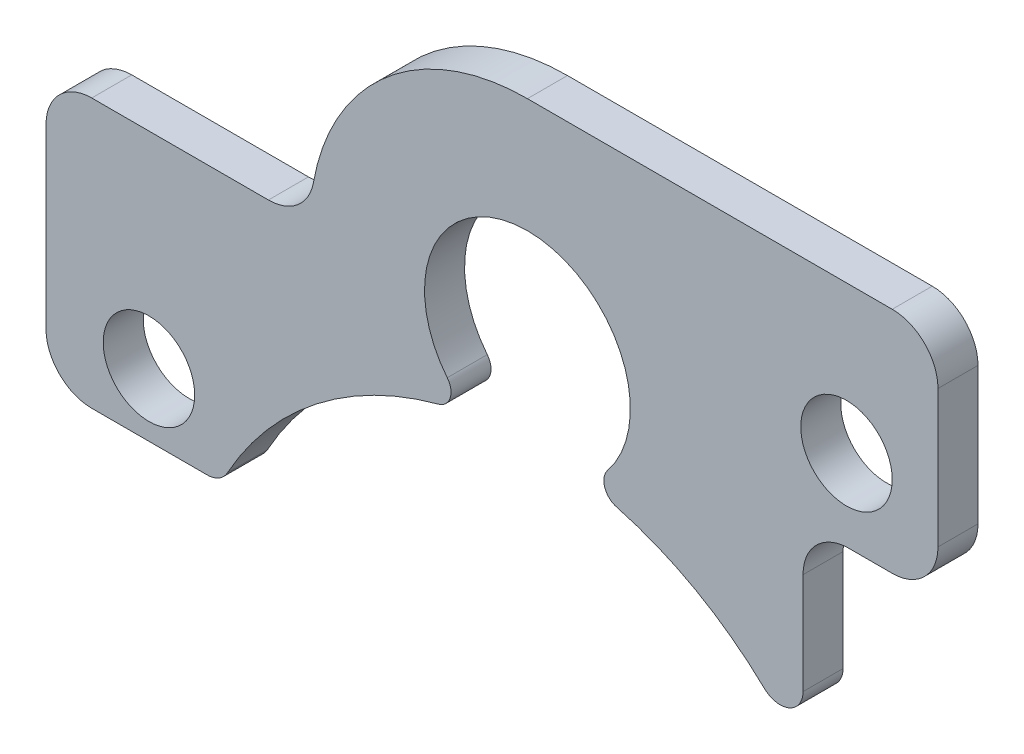
ISO-10303-21;
HEADER;
FILE_DESCRIPTION(('STEP AP214'),'2;1');
FILE_NAME('part.step','',(''),(''),'','','');
FILE_SCHEMA(('AUTOMOTIVE_DESIGN { 1 0 10303 214 1 1 1 1 }'));
ENDSEC;
DATA;
#1=APPLICATION_CONTEXT('core data for automotive mechanical design processes');
#2=APPLICATION_PROTOCOL_DEFINITION('international standard','automotive_design',2000,#1);
#3=PRODUCT_CONTEXT('',#1,'mechanical');
#4=PRODUCT('Part','Part','',(#3));
#5=PRODUCT_RELATED_PRODUCT_CATEGORY('part','',(#4));
#6=PRODUCT_DEFINITION_FORMATION('','',#4);
#7=PRODUCT_DEFINITION_CONTEXT('part definition',#1,'design');
#8=PRODUCT_DEFINITION('design','',#6,#7);
#9=PRODUCT_DEFINITION_SHAPE('','',#8);
#10=(LENGTH_UNIT() NAMED_UNIT(*) SI_UNIT(.MILLI.,.METRE.));
#11=(NAMED_UNIT(*) PLANE_ANGLE_UNIT() SI_UNIT($,.RADIAN.));
#12=(NAMED_UNIT(*) SI_UNIT($,.STERADIAN.) SOLID_ANGLE_UNIT());
#13=UNCERTAINTY_MEASURE_WITH_UNIT(LENGTH_MEASURE(1.E-05),#10,'distance_accuracy_value','');
#14=(GEOMETRIC_REPRESENTATION_CONTEXT(3) GLOBAL_UNCERTAINTY_ASSIGNED_CONTEXT((#13)) GLOBAL_UNIT_ASSIGNED_CONTEXT((#10,
#11,#12)) REPRESENTATION_CONTEXT('',''));
#15=CARTESIAN_POINT('',(0.,0.,0.));
#16=DIRECTION('',(0.,0.,1.));
#17=DIRECTION('',(1.,0.,0.));
#18=AXIS2_PLACEMENT_3D('',#15,#16,#17);
#19=CARTESIAN_POINT('',(0.,0.,1.75));
#20=DIRECTION('',(0.,0.,1.));
#21=DIRECTION('',(1.,0.,0.));
#22=AXIS2_PLACEMENT_3D('',#19,#20,#21);
#23=PLANE('',#22);
#24=CARTESIAN_POINT('',(-16.55,-9.,1.75));
#25=DIRECTION('',(0.,0.,1.));
#26=DIRECTION('',(1.,0.,0.));
#27=AXIS2_PLACEMENT_3D('',#24,#25,#26);
#28=CIRCLE('',#27,2.);
#29=CARTESIAN_POINT('',(-14.55,-9.,1.75));
#30=VERTEX_POINT('',#29);
#31=EDGE_CURVE('E211',#30,#30,#28,.T.);
#32=ORIENTED_EDGE('',*,*,#31,.F.);
#33=EDGE_LOOP('',(#32));
#34=FACE_BOUND('',#33,.T.);
#35=CARTESIAN_POINT('',(0.,0.,1.75));
#36=DIRECTION('',(0.,0.,1.));
#37=DIRECTION('',(1.,0.,0.));
#38=AXIS2_PLACEMENT_3D('',#35,#36,#37);
#39=CIRCLE('',#38,9.5);
#40=CARTESIAN_POINT('',(0.,9.5,1.75));
#41=VERTEX_POINT('',#40);
#42=CARTESIAN_POINT('',(-9.35522962631375,1.65217391304348,1.75));
#43=VERTEX_POINT('',#42);
#44=EDGE_CURVE('E250',#41,#43,#39,.T.);
#45=ORIENTED_EDGE('',*,*,#44,.T.);
#46=CARTESIAN_POINT('',(-11.3247516529061,2.,1.75));
#47=DIRECTION('',(0.,0.,-1.));
#48=DIRECTION('',(1.,0.,0.));
#49=AXIS2_PLACEMENT_3D('',#46,#47,#48);
#50=CIRCLE('',#49,2.);
#51=CARTESIAN_POINT('',(-11.3247516529061,0.,1.75));
#52=VERTEX_POINT('',#51);
#53=EDGE_CURVE('E131',#43,#52,#50,.T.);
#54=ORIENTED_EDGE('',*,*,#53,.T.);
#55=DIRECTION('',(-1.,0.,0.));
#56=VECTOR('',#55,1.);
#57=CARTESIAN_POINT('',(-11.3247516529061,0.,1.75));
#58=LINE('',#57,#56);
#59=CARTESIAN_POINT('',(-19.05,0.,1.75));
#60=VERTEX_POINT('',#59);
#61=EDGE_CURVE('E304',#52,#60,#58,.T.);
#62=ORIENTED_EDGE('',*,*,#61,.T.);
#63=CARTESIAN_POINT('',(-19.05,-2.,1.75));
#64=DIRECTION('',(0.,0.,1.));
#65=DIRECTION('',(1.,0.,0.));
#66=AXIS2_PLACEMENT_3D('',#63,#64,#65);
#67=CIRCLE('',#66,2.);
#68=CARTESIAN_POINT('',(-21.05,-2.,1.75));
#69=VERTEX_POINT('',#68);
#70=EDGE_CURVE('E323',#60,#69,#67,.T.);
#71=ORIENTED_EDGE('',*,*,#70,.T.);
#72=DIRECTION('',(0.,-1.,0.));
#73=VECTOR('',#72,1.);
#74=CARTESIAN_POINT('',(-21.05,-2.,1.75));
#75=LINE('',#74,#73);
#76=CARTESIAN_POINT('',(-21.05,-9.75,1.75));
#77=VERTEX_POINT('',#76);
#78=EDGE_CURVE('E320',#69,#77,#75,.T.);
#79=ORIENTED_EDGE('',*,*,#78,.T.);
#80=CARTESIAN_POINT('',(-19.05,-9.75,1.75));
#81=DIRECTION('',(0.,0.,1.));
#82=DIRECTION('',(1.,0.,0.));
#83=AXIS2_PLACEMENT_3D('',#80,#81,#82);
#84=CIRCLE('',#83,2.);
#85=CARTESIAN_POINT('',(-19.05,-11.75,1.75));
#86=VERTEX_POINT('',#85);
#87=EDGE_CURVE('E322',#77,#86,#84,.T.);
#88=ORIENTED_EDGE('',*,*,#87,.T.);
#89=DIRECTION('',(1.,0.,0.));
#90=VECTOR('',#89,1.);
#91=CARTESIAN_POINT('',(-19.05,-11.75,1.75));
#92=LINE('',#91,#90);
#93=CARTESIAN_POINT('',(-13.9977676791694,-11.75,1.75));
#94=VERTEX_POINT('',#93);
#95=EDGE_CURVE('E325',#86,#94,#92,.T.);
#96=ORIENTED_EDGE('',*,*,#95,.T.);
#97=CARTESIAN_POINT('',(-13.9977676791694,-10.75,1.75));
#98=DIRECTION('',(0.,0.,1.));
#99=DIRECTION('',(1.,0.,0.));
#100=AXIS2_PLACEMENT_3D('',#97,#98,#99);
#101=CIRCLE('',#100,0.999999999999996);
#102=CARTESIAN_POINT('',(-13.1229071992214,-11.234375,1.75));
#103=VERTEX_POINT('',#102);
#104=EDGE_CURVE('E331',#94,#103,#101,.T.);
#105=ORIENTED_EDGE('',*,*,#104,.T.);
#106=CARTESIAN_POINT('',(0.,-18.5000000000001,1.75));
#107=DIRECTION('',(0.,0.,-1.));
#108=DIRECTION('',(1.,0.,0.));
#109=AXIS2_PLACEMENT_3D('',#106,#107,#108);
#110=CIRCLE('',#109,15.);
#111=CARTESIAN_POINT('',(-3.89602308437418,-4.01480051480054,1.75));
#112=VERTEX_POINT('',#111);
#113=EDGE_CURVE('E333',#103,#112,#110,.T.);
#114=ORIENTED_EDGE('',*,*,#113,.T.);
#115=CARTESIAN_POINT('',(-4.0908242385929,-3.29054054054054,1.75));
#116=DIRECTION('',(0.,0.,1.));
#117=DIRECTION('',(1.,0.,0.));
#118=AXIS2_PLACEMENT_3D('',#115,#116,#117);
#119=CIRCLE('',#118,0.750000000000029);
#120=CARTESIAN_POINT('',(-3.50642077593677,-2.82046332046332,1.75));
#121=VERTEX_POINT('',#120);
#122=EDGE_CURVE('E335',#112,#121,#119,.T.);
#123=ORIENTED_EDGE('',*,*,#122,.T.);
#124=CARTESIAN_POINT('',(0.,0.,1.75));
#125=DIRECTION('',(0.,0.,-1.));
#126=DIRECTION('',(1.,0.,0.));
#127=AXIS2_PLACEMENT_3D('',#124,#125,#126);
#128=CIRCLE('',#127,4.5);
#129=CARTESIAN_POINT('',(3.50642077593677,-2.82046332046332,1.75));
#130=VERTEX_POINT('',#129);
#131=EDGE_CURVE('E337',#121,#130,#128,.T.);
#132=ORIENTED_EDGE('',*,*,#131,.T.);
#133=CARTESIAN_POINT('',(4.0908242385929,-3.29054054054054,1.75));
#134=DIRECTION('',(0.,0.,1.));
#135=DIRECTION('',(1.,0.,0.));
#136=AXIS2_PLACEMENT_3D('',#133,#134,#135);
#137=CIRCLE('',#136,0.75);
#138=CARTESIAN_POINT('',(3.89602308437419,-4.01480051480052,1.75));
#139=VERTEX_POINT('',#138);
#140=EDGE_CURVE('E339',#130,#139,#137,.T.);
#141=ORIENTED_EDGE('',*,*,#140,.T.);
#142=CARTESIAN_POINT('',(0.,-18.5000000000001,1.75));
#143=DIRECTION('',(0.,0.,-1.));
#144=DIRECTION('',(1.,0.,0.));
#145=AXIS2_PLACEMENT_3D('',#142,#143,#144);
#146=CIRCLE('',#145,15.0000000000002);
#147=CARTESIAN_POINT('',(10.359375,-7.65180431549215,1.75));
#148=VERTEX_POINT('',#147);
#149=EDGE_CURVE('E341',#139,#148,#146,.T.);
#150=ORIENTED_EDGE('',*,*,#149,.T.);
#151=CARTESIAN_POINT('',(11.05,-6.92859126985829,1.75));
#152=DIRECTION('',(0.,0.,1.));
#153=DIRECTION('',(1.,0.,0.));
#154=AXIS2_PLACEMENT_3D('',#151,#152,#153);
#155=CIRCLE('',#154,1.);
#156=CARTESIAN_POINT('',(12.05,-6.92859126985829,1.75));
#157=VERTEX_POINT('',#156);
#158=EDGE_CURVE('E343',#148,#157,#155,.T.);
#159=ORIENTED_EDGE('',*,*,#158,.T.);
#160=DIRECTION('',(0.,1.,0.));
#161=VECTOR('',#160,1.);
#162=CARTESIAN_POINT('',(12.05,-2.62132034355964,1.75));
#163=LINE('',#162,#161);
#164=CARTESIAN_POINT('',(12.05,-2.50000000000002,1.75));
#165=VERTEX_POINT('',#164);
#166=EDGE_CURVE('E345',#157,#165,#163,.T.);
#167=ORIENTED_EDGE('',*,*,#166,.T.);
#168=CARTESIAN_POINT('',(14.05,-2.5,1.75));
#169=DIRECTION('',(0.,0.,-1.));
#170=DIRECTION('',(1.,0.,0.));
#171=AXIS2_PLACEMENT_3D('',#168,#169,#170);
#172=CIRCLE('',#171,2.);
#173=CARTESIAN_POINT('',(14.05,-0.500000000000003,1.75));
#174=VERTEX_POINT('',#173);
#175=EDGE_CURVE('E347',#165,#174,#172,.T.);
#176=ORIENTED_EDGE('',*,*,#175,.T.);
#177=DIRECTION('',(1.,0.,0.));
#178=VECTOR('',#177,1.);
#179=CARTESIAN_POINT('',(14.05,-0.500000000000003,1.75));
#180=LINE('',#179,#178);
#181=CARTESIAN_POINT('',(15.95,-0.500000000000003,1.75));
#182=VERTEX_POINT('',#181);
#183=EDGE_CURVE('E349',#174,#182,#180,.T.);
#184=ORIENTED_EDGE('',*,*,#183,.T.);
#185=CARTESIAN_POINT('',(15.95,1.5,1.75));
#186=DIRECTION('',(0.,0.,1.));
#187=DIRECTION('',(1.,0.,0.));
#188=AXIS2_PLACEMENT_3D('',#185,#186,#187);
#189=CIRCLE('',#188,2.);
#190=CARTESIAN_POINT('',(17.95,1.50000000000001,1.75));
#191=VERTEX_POINT('',#190);
#192=EDGE_CURVE('E189',#182,#191,#189,.T.);
#193=ORIENTED_EDGE('',*,*,#192,.T.);
#194=DIRECTION('',(0.,1.,0.));
#195=VECTOR('',#194,1.);
#196=CARTESIAN_POINT('',(17.95,1.50000000000001,1.75));
#197=LINE('',#196,#195);
#198=CARTESIAN_POINT('',(17.95,7.49999999999998,1.75));
#199=VERTEX_POINT('',#198);
#200=EDGE_CURVE('E183',#191,#199,#197,.T.);
#201=ORIENTED_EDGE('',*,*,#200,.T.);
#202=CARTESIAN_POINT('',(15.95,7.5,1.75));
#203=DIRECTION('',(0.,0.,1.));
#204=DIRECTION('',(1.,0.,0.));
#205=AXIS2_PLACEMENT_3D('',#202,#203,#204);
#206=CIRCLE('',#205,2.);
#207=CARTESIAN_POINT('',(15.95,9.5,1.75));
#208=VERTEX_POINT('',#207);
#209=EDGE_CURVE('E187',#199,#208,#206,.T.);
#210=ORIENTED_EDGE('',*,*,#209,.T.);
#211=DIRECTION('',(-1.,0.,0.));
#212=VECTOR('',#211,1.);
#213=CARTESIAN_POINT('',(0.,9.5,1.75));
#214=LINE('',#213,#212);
#215=EDGE_CURVE('E49',#208,#41,#214,.T.);
#216=ORIENTED_EDGE('',*,*,#215,.T.);
#217=EDGE_LOOP('',(#45,#54,#62,#71,#79,#88,#96,#105,#114,#123,#132,#141,#150,#159,#167,#176,
#184,#193,#201,#210,#216));
#218=FACE_BOUND('',#217,.T.);
#219=CARTESIAN_POINT('',(13.95,3.04999999999999,1.75));
#220=DIRECTION('',(0.,0.,1.));
#221=DIRECTION('',(1.,0.,0.));
#222=AXIS2_PLACEMENT_3D('',#219,#220,#221);
#223=CIRCLE('',#222,2.);
#224=CARTESIAN_POINT('',(15.95,3.04999999999999,1.75));
#225=VERTEX_POINT('',#224);
#226=EDGE_CURVE('E392',#225,#225,#223,.T.);
#227=ORIENTED_EDGE('',*,*,#226,.F.);
#228=EDGE_LOOP('',(#227));
#229=FACE_BOUND('',#228,.T.);
#230=ADVANCED_FACE('F32',(#34,#218,#229),#23,.T.);
#231=CARTESIAN_POINT('',(0.,0.,0.));
#232=DIRECTION('',(0.,0.,1.));
#233=DIRECTION('',(1.,0.,0.));
#234=AXIS2_PLACEMENT_3D('',#231,#232,#233);
#235=PLANE('',#234);
#236=CARTESIAN_POINT('',(-16.55,-9.,0.));
#237=DIRECTION('',(0.,0.,1.));
#238=DIRECTION('',(1.,0.,0.));
#239=AXIS2_PLACEMENT_3D('',#236,#237,#238);
#240=CIRCLE('',#239,2.);
#241=CARTESIAN_POINT('',(-14.55,-9.,0.));
#242=VERTEX_POINT('',#241);
#243=EDGE_CURVE('E397',#242,#242,#240,.T.);
#244=ORIENTED_EDGE('',*,*,#243,.T.);
#245=EDGE_LOOP('',(#244));
#246=FACE_BOUND('',#245,.T.);
#247=CARTESIAN_POINT('',(0.,0.,0.));
#248=DIRECTION('',(0.,0.,1.));
#249=DIRECTION('',(1.,0.,0.));
#250=AXIS2_PLACEMENT_3D('',#247,#248,#249);
#251=CIRCLE('',#250,9.5);
#252=CARTESIAN_POINT('',(0.,9.5,0.));
#253=VERTEX_POINT('',#252);
#254=CARTESIAN_POINT('',(-9.35522962631375,1.65217391304348,0.));
#255=VERTEX_POINT('',#254);
#256=EDGE_CURVE('E207',#253,#255,#251,.T.);
#257=ORIENTED_EDGE('',*,*,#256,.F.);
#258=DIRECTION('',(-1.,0.,0.));
#259=VECTOR('',#258,1.);
#260=CARTESIAN_POINT('',(0.,9.5,0.));
#261=LINE('',#260,#259);
#262=CARTESIAN_POINT('',(15.95,9.5,0.));
#263=VERTEX_POINT('',#262);
#264=EDGE_CURVE('E123',#263,#253,#261,.T.);
#265=ORIENTED_EDGE('',*,*,#264,.F.);
#266=CARTESIAN_POINT('',(15.95,7.5,0.));
#267=DIRECTION('',(0.,0.,1.));
#268=DIRECTION('',(1.,0.,0.));
#269=AXIS2_PLACEMENT_3D('',#266,#267,#268);
#270=CIRCLE('',#269,2.);
#271=CARTESIAN_POINT('',(17.95,7.49999999999998,0.));
#272=VERTEX_POINT('',#271);
#273=EDGE_CURVE('E117',#272,#263,#270,.T.);
#274=ORIENTED_EDGE('',*,*,#273,.F.);
#275=DIRECTION('',(0.,1.,0.));
#276=VECTOR('',#275,1.);
#277=CARTESIAN_POINT('',(17.95,1.50000000000001,0.));
#278=LINE('',#277,#276);
#279=CARTESIAN_POINT('',(17.95,1.50000000000001,0.));
#280=VERTEX_POINT('',#279);
#281=EDGE_CURVE('E197',#280,#272,#278,.T.);
#282=ORIENTED_EDGE('',*,*,#281,.F.);
#283=CARTESIAN_POINT('',(15.95,1.5,0.));
#284=DIRECTION('',(0.,0.,1.));
#285=DIRECTION('',(1.,0.,0.));
#286=AXIS2_PLACEMENT_3D('',#283,#284,#285);
#287=CIRCLE('',#286,2.);
#288=CARTESIAN_POINT('',(15.95,-0.500000000000003,0.));
#289=VERTEX_POINT('',#288);
#290=EDGE_CURVE('E245',#289,#280,#287,.T.);
#291=ORIENTED_EDGE('',*,*,#290,.F.);
#292=DIRECTION('',(1.,0.,0.));
#293=VECTOR('',#292,1.);
#294=CARTESIAN_POINT('',(14.05,-0.500000000000003,0.));
#295=LINE('',#294,#293);
#296=CARTESIAN_POINT('',(14.05,-0.500000000000003,0.));
#297=VERTEX_POINT('',#296);
#298=EDGE_CURVE('E243',#297,#289,#295,.T.);
#299=ORIENTED_EDGE('',*,*,#298,.F.);
#300=CARTESIAN_POINT('',(14.05,-2.5,0.));
#301=DIRECTION('',(0.,0.,-1.));
#302=DIRECTION('',(1.,0.,0.));
#303=AXIS2_PLACEMENT_3D('',#300,#301,#302);
#304=CIRCLE('',#303,2.);
#305=CARTESIAN_POINT('',(12.05,-2.50000000000002,0.));
#306=VERTEX_POINT('',#305);
#307=EDGE_CURVE('E241',#306,#297,#304,.T.);
#308=ORIENTED_EDGE('',*,*,#307,.F.);
#309=DIRECTION('',(0.,1.,0.));
#310=VECTOR('',#309,1.);
#311=CARTESIAN_POINT('',(12.05,-2.62132034355964,0.));
#312=LINE('',#311,#310);
#313=CARTESIAN_POINT('',(12.05,-6.92859126985829,0.));
#314=VERTEX_POINT('',#313);
#315=EDGE_CURVE('E239',#314,#306,#312,.T.);
#316=ORIENTED_EDGE('',*,*,#315,.F.);
#317=CARTESIAN_POINT('',(11.05,-6.92859126985829,0.));
#318=DIRECTION('',(0.,0.,1.));
#319=DIRECTION('',(1.,0.,0.));
#320=AXIS2_PLACEMENT_3D('',#317,#318,#319);
#321=CIRCLE('',#320,1.);
#322=CARTESIAN_POINT('',(10.359375,-7.65180431549215,0.));
#323=VERTEX_POINT('',#322);
#324=EDGE_CURVE('E236',#323,#314,#321,.T.);
#325=ORIENTED_EDGE('',*,*,#324,.F.);
#326=CARTESIAN_POINT('',(0.,-18.5000000000001,0.));
#327=DIRECTION('',(0.,0.,-1.));
#328=DIRECTION('',(1.,0.,0.));
#329=AXIS2_PLACEMENT_3D('',#326,#327,#328);
#330=CIRCLE('',#329,15.0000000000002);
#331=CARTESIAN_POINT('',(3.89602308437419,-4.01480051480052,0.));
#332=VERTEX_POINT('',#331);
#333=EDGE_CURVE('E234',#332,#323,#330,.T.);
#334=ORIENTED_EDGE('',*,*,#333,.F.);
#335=CARTESIAN_POINT('',(4.0908242385929,-3.29054054054054,0.));
#336=DIRECTION('',(0.,0.,1.));
#337=DIRECTION('',(1.,0.,0.));
#338=AXIS2_PLACEMENT_3D('',#335,#336,#337);
#339=CIRCLE('',#338,0.75);
#340=CARTESIAN_POINT('',(3.50642077593677,-2.82046332046332,0.));
#341=VERTEX_POINT('',#340);
#342=EDGE_CURVE('E232',#341,#332,#339,.T.);
#343=ORIENTED_EDGE('',*,*,#342,.F.);
#344=CARTESIAN_POINT('',(0.,0.,0.));
#345=DIRECTION('',(0.,0.,-1.));
#346=DIRECTION('',(1.,0.,0.));
#347=AXIS2_PLACEMENT_3D('',#344,#345,#346);
#348=CIRCLE('',#347,4.5);
#349=CARTESIAN_POINT('',(-3.50642077593677,-2.82046332046332,0.));
#350=VERTEX_POINT('',#349);
#351=EDGE_CURVE('E230',#350,#341,#348,.T.);
#352=ORIENTED_EDGE('',*,*,#351,.F.);
#353=CARTESIAN_POINT('',(-4.0908242385929,-3.29054054054054,0.));
#354=DIRECTION('',(0.,0.,1.));
#355=DIRECTION('',(1.,0.,0.));
#356=AXIS2_PLACEMENT_3D('',#353,#354,#355);
#357=CIRCLE('',#356,0.750000000000029);
#358=CARTESIAN_POINT('',(-3.89602308437418,-4.01480051480054,0.));
#359=VERTEX_POINT('',#358);
#360=EDGE_CURVE('E227',#359,#350,#357,.T.);
#361=ORIENTED_EDGE('',*,*,#360,.F.);
#362=CARTESIAN_POINT('',(0.,-18.5000000000001,0.));
#363=DIRECTION('',(0.,0.,-1.));
#364=DIRECTION('',(1.,0.,0.));
#365=AXIS2_PLACEMENT_3D('',#362,#363,#364);
#366=CIRCLE('',#365,15.);
#367=CARTESIAN_POINT('',(-13.1229071992214,-11.234375,0.));
#368=VERTEX_POINT('',#367);
#369=EDGE_CURVE('E225',#368,#359,#366,.T.);
#370=ORIENTED_EDGE('',*,*,#369,.F.);
#371=CARTESIAN_POINT('',(-13.9977676791694,-10.75,0.));
#372=DIRECTION('',(0.,0.,1.));
#373=DIRECTION('',(1.,0.,0.));
#374=AXIS2_PLACEMENT_3D('',#371,#372,#373);
#375=CIRCLE('',#374,0.999999999999996);
#376=CARTESIAN_POINT('',(-13.9977676791694,-11.75,0.));
#377=VERTEX_POINT('',#376);
#378=EDGE_CURVE('E223',#377,#368,#375,.T.);
#379=ORIENTED_EDGE('',*,*,#378,.F.);
#380=DIRECTION('',(1.,0.,0.));
#381=VECTOR('',#380,1.);
#382=CARTESIAN_POINT('',(-19.05,-11.75,0.));
#383=LINE('',#382,#381);
#384=CARTESIAN_POINT('',(-19.05,-11.75,0.));
#385=VERTEX_POINT('',#384);
#386=EDGE_CURVE('E221',#385,#377,#383,.T.);
#387=ORIENTED_EDGE('',*,*,#386,.F.);
#388=CARTESIAN_POINT('',(-19.05,-9.75,0.));
#389=DIRECTION('',(0.,0.,1.));
#390=DIRECTION('',(1.,0.,0.));
#391=AXIS2_PLACEMENT_3D('',#388,#389,#390);
#392=CIRCLE('',#391,2.);
#393=CARTESIAN_POINT('',(-21.05,-9.75,0.));
#394=VERTEX_POINT('',#393);
#395=EDGE_CURVE('E219',#394,#385,#392,.T.);
#396=ORIENTED_EDGE('',*,*,#395,.F.);
#397=DIRECTION('',(0.,-1.,0.));
#398=VECTOR('',#397,1.);
#399=CARTESIAN_POINT('',(-21.05,-2.,0.));
#400=LINE('',#399,#398);
#401=CARTESIAN_POINT('',(-21.05,-2.,0.));
#402=VERTEX_POINT('',#401);
#403=EDGE_CURVE('E217',#402,#394,#400,.T.);
#404=ORIENTED_EDGE('',*,*,#403,.F.);
#405=CARTESIAN_POINT('',(-19.05,-2.,0.));
#406=DIRECTION('',(0.,0.,1.));
#407=DIRECTION('',(1.,0.,0.));
#408=AXIS2_PLACEMENT_3D('',#405,#406,#407);
#409=CIRCLE('',#408,2.);
#410=CARTESIAN_POINT('',(-19.05,0.,0.));
#411=VERTEX_POINT('',#410);
#412=EDGE_CURVE('E215',#411,#402,#409,.T.);
#413=ORIENTED_EDGE('',*,*,#412,.F.);
#414=DIRECTION('',(-1.,0.,0.));
#415=VECTOR('',#414,1.);
#416=CARTESIAN_POINT('',(-11.3247516529061,0.,0.));
#417=LINE('',#416,#415);
#418=CARTESIAN_POINT('',(-11.3247516529061,0.,0.));
#419=VERTEX_POINT('',#418);
#420=EDGE_CURVE('E213',#419,#411,#417,.T.);
#421=ORIENTED_EDGE('',*,*,#420,.F.);
#422=CARTESIAN_POINT('',(-11.3247516529061,2.,0.));
#423=DIRECTION('',(0.,0.,-1.));
#424=DIRECTION('',(1.,0.,0.));
#425=AXIS2_PLACEMENT_3D('',#422,#423,#424);
#426=CIRCLE('',#425,2.);
#427=EDGE_CURVE('E210',#255,#419,#426,.T.);
#428=ORIENTED_EDGE('',*,*,#427,.F.);
#429=EDGE_LOOP('',(#257,#265,#274,#282,#291,#299,#308,#316,#325,#334,#343,#352,#361,#370,#379,
#387,#396,#404,#413,#421,#428));
#430=FACE_BOUND('',#429,.T.);
#431=CARTESIAN_POINT('',(13.95,3.04999999999999,0.));
#432=DIRECTION('',(0.,0.,1.));
#433=DIRECTION('',(1.,0.,0.));
#434=AXIS2_PLACEMENT_3D('',#431,#432,#433);
#435=CIRCLE('',#434,2.);
#436=CARTESIAN_POINT('',(15.95,3.04999999999999,0.));
#437=VERTEX_POINT('',#436);
#438=EDGE_CURVE('E395',#437,#437,#435,.T.);
#439=ORIENTED_EDGE('',*,*,#438,.T.);
#440=EDGE_LOOP('',(#439));
#441=FACE_BOUND('',#440,.T.);
#442=ADVANCED_FACE('F308',(#246,#430,#441),#235,.F.);
#443=CARTESIAN_POINT('',(0.,0.,1.75));
#444=DIRECTION('',(0.,0.,-1.));
#445=DIRECTION('',(-1.,0.,0.));
#446=AXIS2_PLACEMENT_3D('',#443,#444,#445);
#447=CYLINDRICAL_SURFACE('',#446,9.5);
#448=ORIENTED_EDGE('',*,*,#256,.T.);
#449=DIRECTION('',(0.,0.,-1.));
#450=VECTOR('',#449,1.);
#451=CARTESIAN_POINT('',(-9.35522962631375,1.65217391304348,1.75));
#452=LINE('',#451,#450);
#453=EDGE_CURVE('E11',#43,#255,#452,.T.);
#454=ORIENTED_EDGE('',*,*,#453,.F.);
#455=ORIENTED_EDGE('',*,*,#44,.F.);
#456=DIRECTION('',(0.,0.,-1.));
#457=VECTOR('',#456,1.);
#458=CARTESIAN_POINT('',(0.,9.5,1.75));
#459=LINE('',#458,#457);
#460=EDGE_CURVE('E203',#41,#253,#459,.T.);
#461=ORIENTED_EDGE('',*,*,#460,.T.);
#462=EDGE_LOOP('',(#448,#454,#455,#461));
#463=FACE_BOUND('',#462,.T.);
#464=ADVANCED_FACE('F34',(#463),#447,.T.);
#465=CARTESIAN_POINT('',(-11.3247516529061,2.,1.75));
#466=DIRECTION('',(0.,0.,-1.));
#467=DIRECTION('',(-1.,0.,0.));
#468=AXIS2_PLACEMENT_3D('',#465,#466,#467);
#469=CYLINDRICAL_SURFACE('',#468,2.);
#470=ORIENTED_EDGE('',*,*,#427,.T.);
#471=DIRECTION('',(0.,0.,-1.));
#472=VECTOR('',#471,1.);
#473=CARTESIAN_POINT('',(-11.3247516529061,0.,1.75));
#474=LINE('',#473,#472);
#475=EDGE_CURVE('E41',#52,#419,#474,.T.);
#476=ORIENTED_EDGE('',*,*,#475,.F.);
#477=ORIENTED_EDGE('',*,*,#53,.F.);
#478=ORIENTED_EDGE('',*,*,#453,.T.);
#479=EDGE_LOOP('',(#470,#476,#477,#478));
#480=FACE_BOUND('',#479,.T.);
#481=ADVANCED_FACE('F582',(#480),#469,.F.);
#482=CARTESIAN_POINT('',(-11.3247516529061,0.,1.75));
#483=DIRECTION('',(0.,-1.,0.));
#484=DIRECTION('',(1.,0.,0.));
#485=AXIS2_PLACEMENT_3D('',#482,#483,#484);
#486=PLANE('',#485);
#487=ORIENTED_EDGE('',*,*,#420,.T.);
#488=DIRECTION('',(0.,0.,-1.));
#489=VECTOR('',#488,1.);
#490=CARTESIAN_POINT('',(-19.05,0.,1.75));
#491=LINE('',#490,#489);
#492=EDGE_CURVE('E296',#60,#411,#491,.T.);
#493=ORIENTED_EDGE('',*,*,#492,.F.);
#494=ORIENTED_EDGE('',*,*,#61,.F.);
#495=ORIENTED_EDGE('',*,*,#475,.T.);
#496=EDGE_LOOP('',(#487,#493,#494,#495));
#497=FACE_BOUND('',#496,.T.);
#498=ADVANCED_FACE('F302',(#497),#486,.F.);
#499=CARTESIAN_POINT('',(-19.05,-2.,1.75));
#500=DIRECTION('',(0.,0.,-1.));
#501=DIRECTION('',(-1.,0.,0.));
#502=AXIS2_PLACEMENT_3D('',#499,#500,#501);
#503=CYLINDRICAL_SURFACE('',#502,2.);
#504=ORIENTED_EDGE('',*,*,#412,.T.);
#505=DIRECTION('',(0.,0.,-1.));
#506=VECTOR('',#505,1.);
#507=CARTESIAN_POINT('',(-21.05,-2.,1.75));
#508=LINE('',#507,#506);
#509=EDGE_CURVE('E293',#69,#402,#508,.T.);
#510=ORIENTED_EDGE('',*,*,#509,.F.);
#511=ORIENTED_EDGE('',*,*,#70,.F.);
#512=ORIENTED_EDGE('',*,*,#492,.T.);
#513=EDGE_LOOP('',(#504,#510,#511,#512));
#514=FACE_BOUND('',#513,.T.);
#515=ADVANCED_FACE('F314',(#514),#503,.T.);
#516=CARTESIAN_POINT('',(-21.05,-2.,1.75));
#517=DIRECTION('',(1.,0.,0.));
#518=DIRECTION('',(0.,0.,-1.));
#519=AXIS2_PLACEMENT_3D('',#516,#517,#518);
#520=PLANE('',#519);
#521=ORIENTED_EDGE('',*,*,#403,.T.);
#522=DIRECTION('',(0.,0.,-1.));
#523=VECTOR('',#522,1.);
#524=CARTESIAN_POINT('',(-21.05,-9.75,1.75));
#525=LINE('',#524,#523);
#526=EDGE_CURVE('E290',#77,#394,#525,.T.);
#527=ORIENTED_EDGE('',*,*,#526,.F.);
#528=ORIENTED_EDGE('',*,*,#78,.F.);
#529=ORIENTED_EDGE('',*,*,#509,.T.);
#530=EDGE_LOOP('',(#521,#527,#528,#529));
#531=FACE_BOUND('',#530,.T.);
#532=ADVANCED_FACE('F318',(#531),#520,.F.);
#533=CARTESIAN_POINT('',(-19.05,-9.75,1.75));
#534=DIRECTION('',(0.,0.,-1.));
#535=DIRECTION('',(-1.,0.,0.));
#536=AXIS2_PLACEMENT_3D('',#533,#534,#535);
#537=CYLINDRICAL_SURFACE('',#536,2.);
#538=ORIENTED_EDGE('',*,*,#395,.T.);
#539=DIRECTION('',(0.,0.,-1.));
#540=VECTOR('',#539,1.);
#541=CARTESIAN_POINT('',(-19.05,-11.75,1.75));
#542=LINE('',#541,#540);
#543=EDGE_CURVE('E287',#86,#385,#542,.T.);
#544=ORIENTED_EDGE('',*,*,#543,.F.);
#545=ORIENTED_EDGE('',*,*,#87,.F.);
#546=ORIENTED_EDGE('',*,*,#526,.T.);
#547=EDGE_LOOP('',(#538,#544,#545,#546));
#548=FACE_BOUND('',#547,.T.);
#549=ADVANCED_FACE('F547',(#548),#537,.T.);
#550=CARTESIAN_POINT('',(-19.05,-11.75,1.75));
#551=DIRECTION('',(0.,1.,0.));
#552=DIRECTION('',(-1.,0.,0.));
#553=AXIS2_PLACEMENT_3D('',#550,#551,#552);
#554=PLANE('',#553);
#555=ORIENTED_EDGE('',*,*,#386,.T.);
#556=DIRECTION('',(0.,0.,-1.));
#557=VECTOR('',#556,1.);
#558=CARTESIAN_POINT('',(-13.9977676791694,-11.75,1.75));
#559=LINE('',#558,#557);
#560=EDGE_CURVE('E284',#94,#377,#559,.T.);
#561=ORIENTED_EDGE('',*,*,#560,.F.);
#562=ORIENTED_EDGE('',*,*,#95,.F.);
#563=ORIENTED_EDGE('',*,*,#543,.T.);
#564=EDGE_LOOP('',(#555,#561,#562,#563));
#565=FACE_BOUND('',#564,.T.);
#566=ADVANCED_FACE('F537',(#565),#554,.F.);
#567=CARTESIAN_POINT('',(-13.9977676791694,-10.75,1.75));
#568=DIRECTION('',(0.,0.,-1.));
#569=DIRECTION('',(-1.,0.,0.));
#570=AXIS2_PLACEMENT_3D('',#567,#568,#569);
#571=CYLINDRICAL_SURFACE('',#570,0.999999999999996);
#572=ORIENTED_EDGE('',*,*,#378,.T.);
#573=DIRECTION('',(0.,0.,-1.));
#574=VECTOR('',#573,1.);
#575=CARTESIAN_POINT('',(-13.1229071992214,-11.234375,1.75));
#576=LINE('',#575,#574);
#577=EDGE_CURVE('E281',#103,#368,#576,.T.);
#578=ORIENTED_EDGE('',*,*,#577,.F.);
#579=ORIENTED_EDGE('',*,*,#104,.F.);
#580=ORIENTED_EDGE('',*,*,#560,.T.);
#581=EDGE_LOOP('',(#572,#578,#579,#580));
#582=FACE_BOUND('',#581,.T.);
#583=ADVANCED_FACE('F527',(#582),#571,.T.);
#584=CARTESIAN_POINT('',(0.,-18.5000000000001,1.75));
#585=DIRECTION('',(0.,0.,-1.));
#586=DIRECTION('',(-1.,0.,0.));
#587=AXIS2_PLACEMENT_3D('',#584,#585,#586);
#588=CYLINDRICAL_SURFACE('',#587,15.);
#589=ORIENTED_EDGE('',*,*,#369,.T.);
#590=DIRECTION('',(0.,0.,-1.));
#591=VECTOR('',#590,1.);
#592=CARTESIAN_POINT('',(-3.89602308437418,-4.01480051480054,1.75));
#593=LINE('',#592,#591);
#594=EDGE_CURVE('E278',#112,#359,#593,.T.);
#595=ORIENTED_EDGE('',*,*,#594,.F.);
#596=ORIENTED_EDGE('',*,*,#113,.F.);
#597=ORIENTED_EDGE('',*,*,#577,.T.);
#598=EDGE_LOOP('',(#589,#595,#596,#597));
#599=FACE_BOUND('',#598,.T.);
#600=ADVANCED_FACE('F517',(#599),#588,.F.);
#601=CARTESIAN_POINT('',(-4.0908242385929,-3.29054054054054,1.75));
#602=DIRECTION('',(0.,0.,-1.));
#603=DIRECTION('',(-1.,0.,0.));
#604=AXIS2_PLACEMENT_3D('',#601,#602,#603);
#605=CYLINDRICAL_SURFACE('',#604,0.750000000000029);
#606=ORIENTED_EDGE('',*,*,#360,.T.);
#607=DIRECTION('',(0.,0.,-1.));
#608=VECTOR('',#607,1.);
#609=CARTESIAN_POINT('',(-3.50642077593677,-2.82046332046332,1.75));
#610=LINE('',#609,#608);
#611=EDGE_CURVE('E275',#121,#350,#610,.T.);
#612=ORIENTED_EDGE('',*,*,#611,.F.);
#613=ORIENTED_EDGE('',*,*,#122,.F.);
#614=ORIENTED_EDGE('',*,*,#594,.T.);
#615=EDGE_LOOP('',(#606,#612,#613,#614));
#616=FACE_BOUND('',#615,.T.);
#617=ADVANCED_FACE('F506',(#616),#605,.T.);
#618=CARTESIAN_POINT('',(0.,0.,1.75));
#619=DIRECTION('',(0.,0.,-1.));
#620=DIRECTION('',(-1.,0.,0.));
#621=AXIS2_PLACEMENT_3D('',#618,#619,#620);
#622=CYLINDRICAL_SURFACE('',#621,4.5);
#623=ORIENTED_EDGE('',*,*,#351,.T.);
#624=DIRECTION('',(0.,0.,-1.));
#625=VECTOR('',#624,1.);
#626=CARTESIAN_POINT('',(3.50642077593677,-2.82046332046332,1.75));
#627=LINE('',#626,#625);
#628=EDGE_CURVE('E272',#130,#341,#627,.T.);
#629=ORIENTED_EDGE('',*,*,#628,.F.);
#630=ORIENTED_EDGE('',*,*,#131,.F.);
#631=ORIENTED_EDGE('',*,*,#611,.T.);
#632=EDGE_LOOP('',(#623,#629,#630,#631));
#633=FACE_BOUND('',#632,.T.);
#634=ADVANCED_FACE('F496',(#633),#622,.F.);
#635=CARTESIAN_POINT('',(4.0908242385929,-3.29054054054054,1.75));
#636=DIRECTION('',(0.,0.,-1.));
#637=DIRECTION('',(-1.,0.,0.));
#638=AXIS2_PLACEMENT_3D('',#635,#636,#637);
#639=CYLINDRICAL_SURFACE('',#638,0.75);
#640=ORIENTED_EDGE('',*,*,#342,.T.);
#641=DIRECTION('',(0.,0.,-1.));
#642=VECTOR('',#641,1.);
#643=CARTESIAN_POINT('',(3.89602308437419,-4.01480051480052,1.75));
#644=LINE('',#643,#642);
#645=EDGE_CURVE('E269',#139,#332,#644,.T.);
#646=ORIENTED_EDGE('',*,*,#645,.F.);
#647=ORIENTED_EDGE('',*,*,#140,.F.);
#648=ORIENTED_EDGE('',*,*,#628,.T.);
#649=EDGE_LOOP('',(#640,#646,#647,#648));
#650=FACE_BOUND('',#649,.T.);
#651=ADVANCED_FACE('F486',(#650),#639,.T.);
#652=CARTESIAN_POINT('',(0.,-18.5000000000001,1.75));
#653=DIRECTION('',(0.,0.,-1.));
#654=DIRECTION('',(-1.,0.,0.));
#655=AXIS2_PLACEMENT_3D('',#652,#653,#654);
#656=CYLINDRICAL_SURFACE('',#655,15.0000000000002);
#657=ORIENTED_EDGE('',*,*,#333,.T.);
#658=DIRECTION('',(0.,0.,-1.));
#659=VECTOR('',#658,1.);
#660=CARTESIAN_POINT('',(10.359375,-7.65180431549215,1.75));
#661=LINE('',#660,#659);
#662=EDGE_CURVE('E266',#148,#323,#661,.T.);
#663=ORIENTED_EDGE('',*,*,#662,.F.);
#664=ORIENTED_EDGE('',*,*,#149,.F.);
#665=ORIENTED_EDGE('',*,*,#645,.T.);
#666=EDGE_LOOP('',(#657,#663,#664,#665));
#667=FACE_BOUND('',#666,.T.);
#668=ADVANCED_FACE('F476',(#667),#656,.F.);
#669=CARTESIAN_POINT('',(11.05,-6.92859126985829,1.75));
#670=DIRECTION('',(0.,0.,-1.));
#671=DIRECTION('',(-1.,0.,0.));
#672=AXIS2_PLACEMENT_3D('',#669,#670,#671);
#673=CYLINDRICAL_SURFACE('',#672,1.);
#674=ORIENTED_EDGE('',*,*,#324,.T.);
#675=DIRECTION('',(0.,0.,-1.));
#676=VECTOR('',#675,1.);
#677=CARTESIAN_POINT('',(12.05,-6.92859126985829,1.75));
#678=LINE('',#677,#676);
#679=EDGE_CURVE('E263',#157,#314,#678,.T.);
#680=ORIENTED_EDGE('',*,*,#679,.F.);
#681=ORIENTED_EDGE('',*,*,#158,.F.);
#682=ORIENTED_EDGE('',*,*,#662,.T.);
#683=EDGE_LOOP('',(#674,#680,#681,#682));
#684=FACE_BOUND('',#683,.T.);
#685=ADVANCED_FACE('F465',(#684),#673,.T.);
#686=CARTESIAN_POINT('',(12.05,-2.62132034355964,1.75));
#687=DIRECTION('',(-1.,0.,0.));
#688=DIRECTION('',(0.,0.,1.));
#689=AXIS2_PLACEMENT_3D('',#686,#687,#688);
#690=PLANE('',#689);
#691=ORIENTED_EDGE('',*,*,#315,.T.);
#692=DIRECTION('',(0.,0.,-1.));
#693=VECTOR('',#692,1.);
#694=CARTESIAN_POINT('',(12.05,-2.50000000000002,1.75));
#695=LINE('',#694,#693);
#696=EDGE_CURVE('E260',#165,#306,#695,.T.);
#697=ORIENTED_EDGE('',*,*,#696,.F.);
#698=ORIENTED_EDGE('',*,*,#166,.F.);
#699=ORIENTED_EDGE('',*,*,#679,.T.);
#700=EDGE_LOOP('',(#691,#697,#698,#699));
#701=FACE_BOUND('',#700,.T.);
#702=ADVANCED_FACE('F455',(#701),#690,.F.);
#703=CARTESIAN_POINT('',(14.05,-2.5,1.75));
#704=DIRECTION('',(0.,0.,-1.));
#705=DIRECTION('',(-1.,0.,0.));
#706=AXIS2_PLACEMENT_3D('',#703,#704,#705);
#707=CYLINDRICAL_SURFACE('',#706,2.);
#708=ORIENTED_EDGE('',*,*,#307,.T.);
#709=DIRECTION('',(0.,0.,-1.));
#710=VECTOR('',#709,1.);
#711=CARTESIAN_POINT('',(14.05,-0.500000000000003,1.75));
#712=LINE('',#711,#710);
#713=EDGE_CURVE('E257',#174,#297,#712,.T.);
#714=ORIENTED_EDGE('',*,*,#713,.F.);
#715=ORIENTED_EDGE('',*,*,#175,.F.);
#716=ORIENTED_EDGE('',*,*,#696,.T.);
#717=EDGE_LOOP('',(#708,#714,#715,#716));
#718=FACE_BOUND('',#717,.T.);
#719=ADVANCED_FACE('F446',(#718),#707,.F.);
#720=CARTESIAN_POINT('',(14.05,-0.500000000000003,1.75));
#721=DIRECTION('',(0.,1.,0.));
#722=DIRECTION('',(0.,0.,1.));
#723=AXIS2_PLACEMENT_3D('',#720,#721,#722);
#724=PLANE('',#723);
#725=ORIENTED_EDGE('',*,*,#298,.T.);
#726=DIRECTION('',(0.,0.,-1.));
#727=VECTOR('',#726,1.);
#728=CARTESIAN_POINT('',(15.95,-0.500000000000003,1.75));
#729=LINE('',#728,#727);
#730=EDGE_CURVE('E254',#182,#289,#729,.T.);
#731=ORIENTED_EDGE('',*,*,#730,.F.);
#732=ORIENTED_EDGE('',*,*,#183,.F.);
#733=ORIENTED_EDGE('',*,*,#713,.T.);
#734=EDGE_LOOP('',(#725,#731,#732,#733));
#735=FACE_BOUND('',#734,.T.);
#736=ADVANCED_FACE('F355',(#735),#724,.F.);
#737=CARTESIAN_POINT('',(15.95,1.5,1.75));
#738=DIRECTION('',(0.,0.,-1.));
#739=DIRECTION('',(-1.,0.,0.));
#740=AXIS2_PLACEMENT_3D('',#737,#738,#739);
#741=CYLINDRICAL_SURFACE('',#740,2.);
#742=ORIENTED_EDGE('',*,*,#290,.T.);
#743=DIRECTION('',(0.,0.,-1.));
#744=VECTOR('',#743,1.);
#745=CARTESIAN_POINT('',(17.95,1.50000000000001,1.75));
#746=LINE('',#745,#744);
#747=EDGE_CURVE('E198',#191,#280,#746,.T.);
#748=ORIENTED_EDGE('',*,*,#747,.F.);
#749=ORIENTED_EDGE('',*,*,#192,.F.);
#750=ORIENTED_EDGE('',*,*,#730,.T.);
#751=EDGE_LOOP('',(#742,#748,#749,#750));
#752=FACE_BOUND('',#751,.T.);
#753=ADVANCED_FACE('F359',(#752),#741,.T.);
#754=CARTESIAN_POINT('',(17.95,1.50000000000001,1.75));
#755=DIRECTION('',(-1.,0.,0.));
#756=DIRECTION('',(0.,0.,1.));
#757=AXIS2_PLACEMENT_3D('',#754,#755,#756);
#758=PLANE('',#757);
#759=ORIENTED_EDGE('',*,*,#281,.T.);
#760=DIRECTION('',(0.,0.,-1.));
#761=VECTOR('',#760,1.);
#762=CARTESIAN_POINT('',(17.95,7.49999999999998,1.75));
#763=LINE('',#762,#761);
#764=EDGE_CURVE('E194',#199,#272,#763,.T.);
#765=ORIENTED_EDGE('',*,*,#764,.F.);
#766=ORIENTED_EDGE('',*,*,#200,.F.);
#767=ORIENTED_EDGE('',*,*,#747,.T.);
#768=EDGE_LOOP('',(#759,#765,#766,#767));
#769=FACE_BOUND('',#768,.T.);
#770=ADVANCED_FACE('F195',(#769),#758,.F.);
#771=CARTESIAN_POINT('',(15.95,7.5,1.75));
#772=DIRECTION('',(0.,0.,-1.));
#773=DIRECTION('',(-1.,0.,0.));
#774=AXIS2_PLACEMENT_3D('',#771,#772,#773);
#775=CYLINDRICAL_SURFACE('',#774,2.);
#776=ORIENTED_EDGE('',*,*,#273,.T.);
#777=DIRECTION('',(0.,0.,-1.));
#778=VECTOR('',#777,1.);
#779=CARTESIAN_POINT('',(15.95,9.5,1.75));
#780=LINE('',#779,#778);
#781=EDGE_CURVE('E199',#208,#263,#780,.T.);
#782=ORIENTED_EDGE('',*,*,#781,.F.);
#783=ORIENTED_EDGE('',*,*,#209,.F.);
#784=ORIENTED_EDGE('',*,*,#764,.T.);
#785=EDGE_LOOP('',(#776,#782,#783,#784));
#786=FACE_BOUND('',#785,.T.);
#787=ADVANCED_FACE('F201',(#786),#775,.T.);
#788=CARTESIAN_POINT('',(0.,9.5,1.75));
#789=DIRECTION('',(0.,-1.,0.));
#790=DIRECTION('',(1.,0.,0.));
#791=AXIS2_PLACEMENT_3D('',#788,#789,#790);
#792=PLANE('',#791);
#793=ORIENTED_EDGE('',*,*,#264,.T.);
#794=ORIENTED_EDGE('',*,*,#460,.F.);
#795=ORIENTED_EDGE('',*,*,#215,.F.);
#796=ORIENTED_EDGE('',*,*,#781,.T.);
#797=EDGE_LOOP('',(#793,#794,#795,#796));
#798=FACE_BOUND('',#797,.T.);
#799=ADVANCED_FACE('F363',(#798),#792,.F.);
#800=CARTESIAN_POINT('',(-16.55,-9.,1.75));
#801=DIRECTION('',(0.,0.,-1.));
#802=DIRECTION('',(-1.,0.,0.));
#803=AXIS2_PLACEMENT_3D('',#800,#801,#802);
#804=CYLINDRICAL_SURFACE('',#803,2.);
#805=ORIENTED_EDGE('',*,*,#31,.T.);
#806=EDGE_LOOP('',(#805));
#807=FACE_BOUND('',#806,.T.);
#808=ORIENTED_EDGE('',*,*,#243,.F.);
#809=EDGE_LOOP('',(#808));
#810=FACE_BOUND('',#809,.T.);
#811=ADVANCED_FACE('F365',(#807,#810),#804,.F.);
#812=CARTESIAN_POINT('',(13.95,3.04999999999999,1.75));
#813=DIRECTION('',(0.,0.,-1.));
#814=DIRECTION('',(-1.,0.,0.));
#815=AXIS2_PLACEMENT_3D('',#812,#813,#814);
#816=CYLINDRICAL_SURFACE('',#815,2.);
#817=ORIENTED_EDGE('',*,*,#226,.T.);
#818=EDGE_LOOP('',(#817));
#819=FACE_BOUND('',#818,.T.);
#820=ORIENTED_EDGE('',*,*,#438,.F.);
#821=EDGE_LOOP('',(#820));
#822=FACE_BOUND('',#821,.T.);
#823=ADVANCED_FACE('F371',(#819,#822),#816,.F.);
#824=CLOSED_SHELL('',(#230,#442,#464,#481,#498,#515,#532,#549,#566,#583,#600,#617,#634,#651,
#668,#685,#702,#719,#736,#753,#770,#787,#799,#811,#823));
#825=MANIFOLD_SOLID_BREP('B2',#824);
#826=ADVANCED_BREP_SHAPE_REPRESENTATION('',(#18,#825),#14);
#827=SHAPE_DEFINITION_REPRESENTATION(#9,#826);
ENDSEC;
END-ISO-10303-21;
